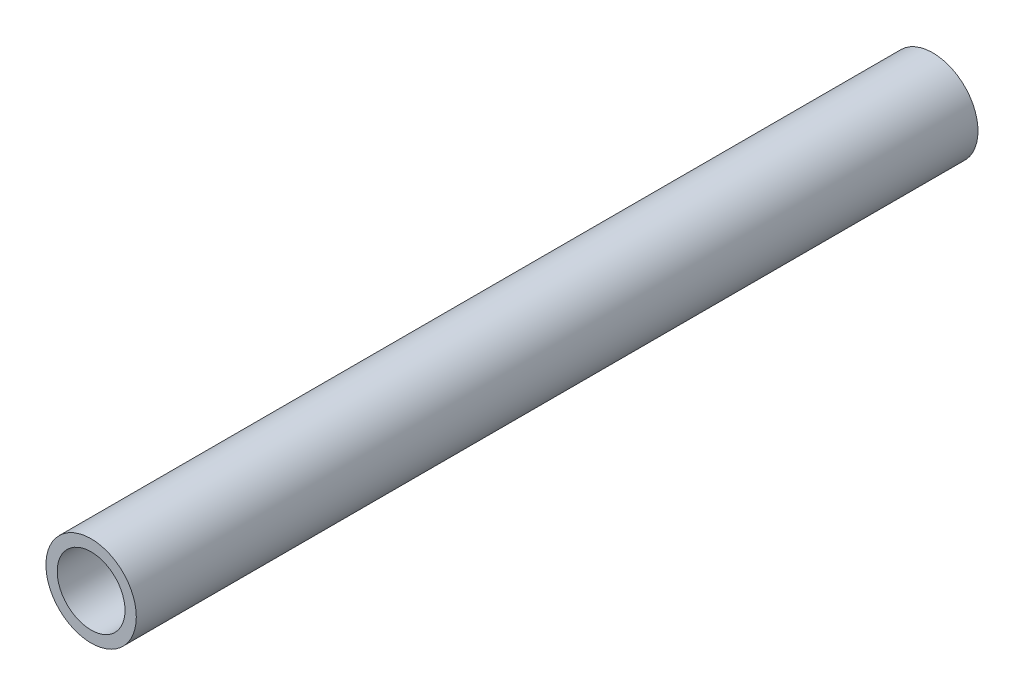
ISO-10303-21;
HEADER;
FILE_DESCRIPTION(('STEP AP214'),'2;1');
FILE_NAME('part.step','',(''),(''),'','','');
FILE_SCHEMA(('AUTOMOTIVE_DESIGN { 1 0 10303 214 1 1 1 1 }'));
ENDSEC;
DATA;
#1=APPLICATION_CONTEXT('core data for automotive mechanical design processes');
#2=APPLICATION_PROTOCOL_DEFINITION('international standard','automotive_design',2000,#1);
#3=PRODUCT_CONTEXT('',#1,'mechanical');
#4=PRODUCT('Part','Part','',(#3));
#5=PRODUCT_RELATED_PRODUCT_CATEGORY('part','',(#4));
#6=PRODUCT_DEFINITION_FORMATION('','',#4);
#7=PRODUCT_DEFINITION_CONTEXT('part definition',#1,'design');
#8=PRODUCT_DEFINITION('design','',#6,#7);
#9=PRODUCT_DEFINITION_SHAPE('','',#8);
#10=(LENGTH_UNIT() NAMED_UNIT(*) SI_UNIT(.MILLI.,.METRE.));
#11=(NAMED_UNIT(*) PLANE_ANGLE_UNIT() SI_UNIT($,.RADIAN.));
#12=(NAMED_UNIT(*) SI_UNIT($,.STERADIAN.) SOLID_ANGLE_UNIT());
#13=UNCERTAINTY_MEASURE_WITH_UNIT(LENGTH_MEASURE(1.E-05),#10,'distance_accuracy_value','');
#14=(GEOMETRIC_REPRESENTATION_CONTEXT(3) GLOBAL_UNCERTAINTY_ASSIGNED_CONTEXT((#13)) GLOBAL_UNIT_ASSIGNED_CONTEXT((#10,
#11,#12)) REPRESENTATION_CONTEXT('',''));
#15=CARTESIAN_POINT('',(0.,0.,0.));
#16=DIRECTION('',(0.,0.,1.));
#17=DIRECTION('',(1.,0.,0.));
#18=AXIS2_PLACEMENT_3D('',#15,#16,#17);
#19=CARTESIAN_POINT('',(0.,0.,74.5));
#20=DIRECTION('',(0.,0.,1.));
#21=DIRECTION('',(1.,0.,0.));
#22=AXIS2_PLACEMENT_3D('',#19,#20,#21);
#23=PLANE('',#22);
#24=CARTESIAN_POINT('',(0.,0.,74.5));
#25=DIRECTION('',(0.,0.,1.));
#26=DIRECTION('',(1.,0.,0.));
#27=AXIS2_PLACEMENT_3D('',#24,#25,#26);
#28=CIRCLE('',#27,8.);
#29=CARTESIAN_POINT('',(8.,0.,74.5));
#30=VERTEX_POINT('',#29);
#31=EDGE_CURVE('E10',#30,#30,#28,.T.);
#32=ORIENTED_EDGE('',*,*,#31,.T.);
#33=EDGE_LOOP('',(#32));
#34=FACE_BOUND('',#33,.T.);
#35=CARTESIAN_POINT('',(0.,0.,74.5));
#36=DIRECTION('',(0.,0.,1.));
#37=DIRECTION('',(1.,0.,0.));
#38=AXIS2_PLACEMENT_3D('',#35,#36,#37);
#39=CIRCLE('',#38,6.);
#40=CARTESIAN_POINT('',(6.,0.,74.5));
#41=VERTEX_POINT('',#40);
#42=EDGE_CURVE('E41',#41,#41,#39,.T.);
#43=ORIENTED_EDGE('',*,*,#42,.F.);
#44=EDGE_LOOP('',(#43));
#45=FACE_BOUND('',#44,.T.);
#46=ADVANCED_FACE('F30',(#34,#45),#23,.T.);
#47=CARTESIAN_POINT('',(0.,0.,-74.5));
#48=DIRECTION('',(0.,0.,1.));
#49=DIRECTION('',(1.,0.,0.));
#50=AXIS2_PLACEMENT_3D('',#47,#48,#49);
#51=PLANE('',#50);
#52=CARTESIAN_POINT('',(0.,0.,-74.5));
#53=DIRECTION('',(0.,0.,1.));
#54=DIRECTION('',(1.,0.,0.));
#55=AXIS2_PLACEMENT_3D('',#52,#53,#54);
#56=CIRCLE('',#55,8.);
#57=CARTESIAN_POINT('',(8.,0.,-74.5));
#58=VERTEX_POINT('',#57);
#59=EDGE_CURVE('E34',#58,#58,#56,.T.);
#60=ORIENTED_EDGE('',*,*,#59,.F.);
#61=EDGE_LOOP('',(#60));
#62=FACE_BOUND('',#61,.T.);
#63=CARTESIAN_POINT('',(0.,0.,-74.5));
#64=DIRECTION('',(0.,0.,1.));
#65=DIRECTION('',(1.,0.,0.));
#66=AXIS2_PLACEMENT_3D('',#63,#64,#65);
#67=CIRCLE('',#66,6.);
#68=CARTESIAN_POINT('',(6.,0.,-74.5));
#69=VERTEX_POINT('',#68);
#70=EDGE_CURVE('E43',#69,#69,#67,.T.);
#71=ORIENTED_EDGE('',*,*,#70,.T.);
#72=EDGE_LOOP('',(#71));
#73=FACE_BOUND('',#72,.T.);
#74=ADVANCED_FACE('F53',(#62,#73),#51,.F.);
#75=CARTESIAN_POINT('',(0.,0.,74.5));
#76=DIRECTION('',(0.,0.,-1.));
#77=DIRECTION('',(-1.,0.,0.));
#78=AXIS2_PLACEMENT_3D('',#75,#76,#77);
#79=CYLINDRICAL_SURFACE('',#78,8.);
#80=ORIENTED_EDGE('',*,*,#31,.F.);
#81=EDGE_LOOP('',(#80));
#82=FACE_BOUND('',#81,.T.);
#83=ORIENTED_EDGE('',*,*,#59,.T.);
#84=EDGE_LOOP('',(#83));
#85=FACE_BOUND('',#84,.T.);
#86=ADVANCED_FACE('F32',(#82,#85),#79,.T.);
#87=CARTESIAN_POINT('',(0.,0.,74.5));
#88=DIRECTION('',(0.,0.,-1.));
#89=DIRECTION('',(-1.,0.,0.));
#90=AXIS2_PLACEMENT_3D('',#87,#88,#89);
#91=CYLINDRICAL_SURFACE('',#90,6.);
#92=ORIENTED_EDGE('',*,*,#42,.T.);
#93=EDGE_LOOP('',(#92));
#94=FACE_BOUND('',#93,.T.);
#95=ORIENTED_EDGE('',*,*,#70,.F.);
#96=EDGE_LOOP('',(#95));
#97=FACE_BOUND('',#96,.T.);
#98=ADVANCED_FACE('F49',(#94,#97),#91,.F.);
#99=CLOSED_SHELL('',(#46,#74,#86,#98));
#100=MANIFOLD_SOLID_BREP('B2',#99);
#101=ADVANCED_BREP_SHAPE_REPRESENTATION('',(#18,#100),#14);
#102=SHAPE_DEFINITION_REPRESENTATION(#9,#101);
ENDSEC;
END-ISO-10303-21;
